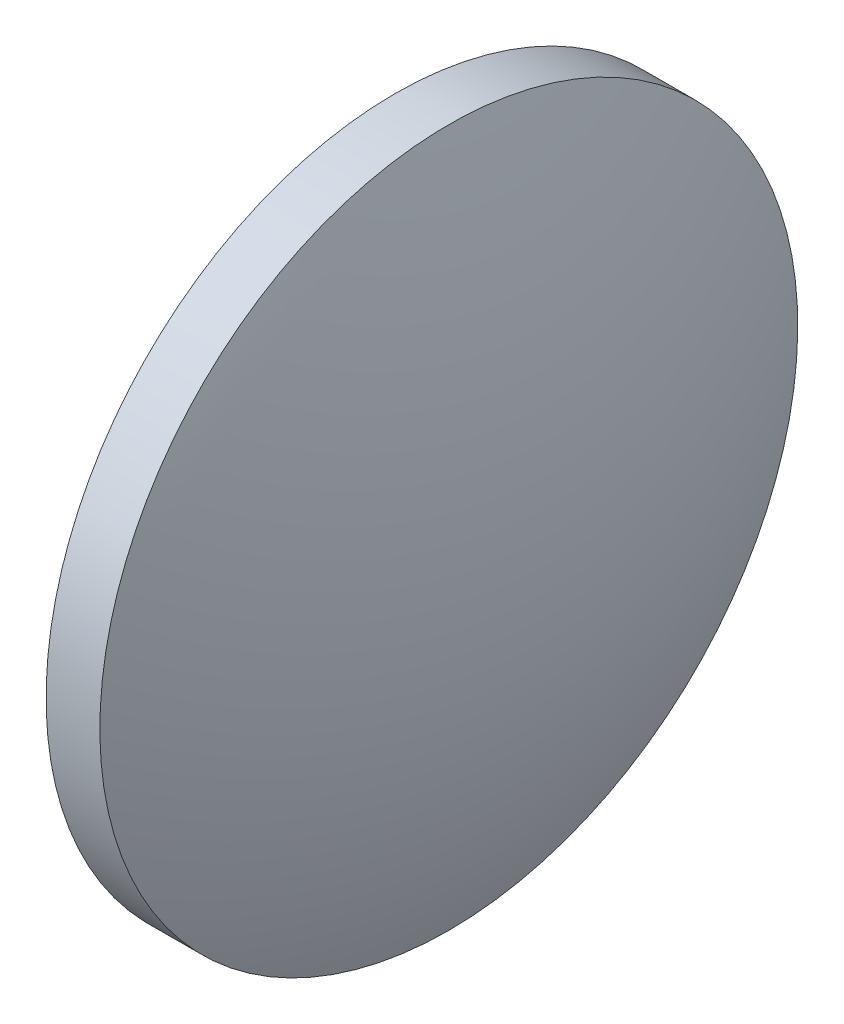
ISO-10303-21;
HEADER;
FILE_DESCRIPTION(('STEP AP214'),'2;1');
FILE_NAME('part.step','',(''),(''),'','','');
FILE_SCHEMA(('AUTOMOTIVE_DESIGN { 1 0 10303 214 1 1 1 1 }'));
ENDSEC;
DATA;
#1=APPLICATION_CONTEXT('core data for automotive mechanical design processes');
#2=APPLICATION_PROTOCOL_DEFINITION('international standard','automotive_design',2000,#1);
#3=PRODUCT_CONTEXT('',#1,'mechanical');
#4=PRODUCT('Part','Part','',(#3));
#5=PRODUCT_RELATED_PRODUCT_CATEGORY('part','',(#4));
#6=PRODUCT_DEFINITION_FORMATION('','',#4);
#7=PRODUCT_DEFINITION_CONTEXT('part definition',#1,'design');
#8=PRODUCT_DEFINITION('design','',#6,#7);
#9=PRODUCT_DEFINITION_SHAPE('','',#8);
#10=(LENGTH_UNIT() NAMED_UNIT(*) SI_UNIT(.MILLI.,.METRE.));
#11=(NAMED_UNIT(*) PLANE_ANGLE_UNIT() SI_UNIT($,.RADIAN.));
#12=(NAMED_UNIT(*) SI_UNIT($,.STERADIAN.) SOLID_ANGLE_UNIT());
#13=UNCERTAINTY_MEASURE_WITH_UNIT(LENGTH_MEASURE(1.E-05),#10,'distance_accuracy_value','');
#14=(GEOMETRIC_REPRESENTATION_CONTEXT(3) GLOBAL_UNCERTAINTY_ASSIGNED_CONTEXT((#13)) GLOBAL_UNIT_ASSIGNED_CONTEXT((#10,
#11,#12)) REPRESENTATION_CONTEXT('',''));
#15=CARTESIAN_POINT('',(0.,0.,0.));
#16=DIRECTION('',(0.,0.,1.));
#17=DIRECTION('',(1.,0.,0.));
#18=AXIS2_PLACEMENT_3D('',#15,#16,#17);
#19=CARTESIAN_POINT('',(-7.00019435706194,0.,0.));
#20=DIRECTION('',(-1.,0.,0.));
#21=DIRECTION('',(0.,-1.,0.));
#22=AXIS2_PLACEMENT_3D('',#19,#20,#21);
#23=SPHERICAL_SURFACE('',#22,7.82889047369212);
#24=CARTESIAN_POINT('',(0.231093636723624,0.,0.));
#25=DIRECTION('',(-1.,0.,0.));
#26=DIRECTION('',(0.,-1.,0.));
#27=AXIS2_PLACEMENT_3D('',#24,#25,#26);
#28=CIRCLE('',#27,3.);
#29=CARTESIAN_POINT('',(0.231093636723625,-3.,0.));
#30=VERTEX_POINT('',#29);
#31=EDGE_CURVE('E10',#30,#30,#28,.T.);
#32=ORIENTED_EDGE('',*,*,#31,.F.);
#33=EDGE_LOOP('',(#32));
#34=FACE_BOUND('',#33,.T.);
#35=ADVANCED_FACE('F33',(#34),#23,.T.);
#36=CARTESIAN_POINT('',(-0.828696116630183,0.,0.));
#37=DIRECTION('',(-1.,0.,0.));
#38=DIRECTION('',(0.,-1.,0.));
#39=AXIS2_PLACEMENT_3D('',#36,#37,#38);
#40=CYLINDRICAL_SURFACE('',#39,3.);
#41=CARTESIAN_POINT('',(-0.231093636723625,0.,0.));
#42=DIRECTION('',(-1.,0.,0.));
#43=DIRECTION('',(0.,-1.,0.));
#44=AXIS2_PLACEMENT_3D('',#41,#42,#43);
#45=CIRCLE('',#44,3.);
#46=CARTESIAN_POINT('',(-0.231093636723624,-3.,0.));
#47=VERTEX_POINT('',#46);
#48=EDGE_CURVE('E39',#47,#47,#45,.T.);
#49=ORIENTED_EDGE('',*,*,#48,.F.);
#50=EDGE_LOOP('',(#49));
#51=FACE_BOUND('',#50,.T.);
#52=ORIENTED_EDGE('',*,*,#31,.T.);
#53=EDGE_LOOP('',(#52));
#54=FACE_BOUND('',#53,.T.);
#55=ADVANCED_FACE('F47',(#51,#54),#40,.T.);
#56=CARTESIAN_POINT('',(7.00019435706194,0.,0.));
#57=DIRECTION('',(-1.,0.,0.));
#58=DIRECTION('',(0.,1.,0.));
#59=AXIS2_PLACEMENT_3D('',#56,#57,#58);
#60=SPHERICAL_SURFACE('',#59,7.82889047369212);
#61=ORIENTED_EDGE('',*,*,#48,.T.);
#62=EDGE_LOOP('',(#61));
#63=FACE_BOUND('',#62,.T.);
#64=ADVANCED_FACE('F45',(#63),#60,.T.);
#65=CLOSED_SHELL('',(#35,#55,#64));
#66=MANIFOLD_SOLID_BREP('B2',#65);
#67=ADVANCED_BREP_SHAPE_REPRESENTATION('',(#18,#66),#14);
#68=SHAPE_DEFINITION_REPRESENTATION(#9,#67);
ENDSEC;
END-ISO-10303-21;
